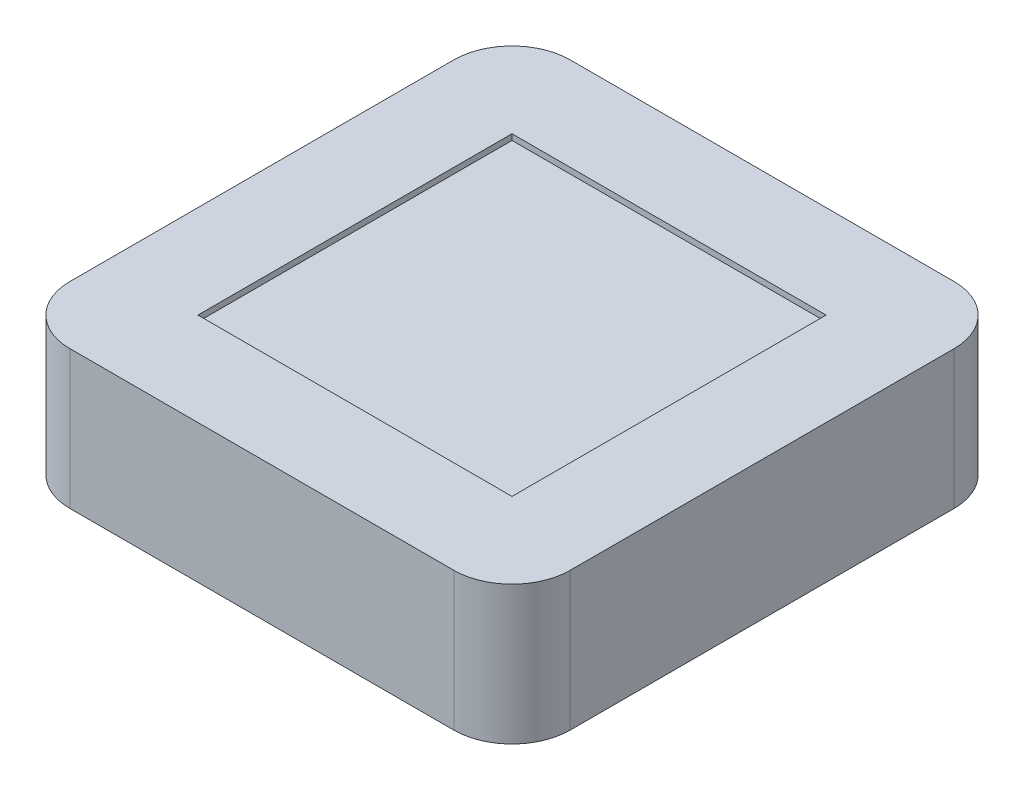
ISO-10303-21;
HEADER;
FILE_DESCRIPTION(('STEP AP214'),'2;1');
FILE_NAME('part.step','',(''),(''),'','','');
FILE_SCHEMA(('AUTOMOTIVE_DESIGN { 1 0 10303 214 1 1 1 1 }'));
ENDSEC;
DATA;
#1=APPLICATION_CONTEXT('core data for automotive mechanical design processes');
#2=APPLICATION_PROTOCOL_DEFINITION('international standard','automotive_design',2000,#1);
#3=PRODUCT_CONTEXT('',#1,'mechanical');
#4=PRODUCT('Part','Part','',(#3));
#5=PRODUCT_RELATED_PRODUCT_CATEGORY('part','',(#4));
#6=PRODUCT_DEFINITION_FORMATION('','',#4);
#7=PRODUCT_DEFINITION_CONTEXT('part definition',#1,'design');
#8=PRODUCT_DEFINITION('design','',#6,#7);
#9=PRODUCT_DEFINITION_SHAPE('','',#8);
#10=(LENGTH_UNIT() NAMED_UNIT(*) SI_UNIT(.MILLI.,.METRE.));
#11=(NAMED_UNIT(*) PLANE_ANGLE_UNIT() SI_UNIT($,.RADIAN.));
#12=(NAMED_UNIT(*) SI_UNIT($,.STERADIAN.) SOLID_ANGLE_UNIT());
#13=UNCERTAINTY_MEASURE_WITH_UNIT(LENGTH_MEASURE(1.E-05),#10,'distance_accuracy_value','');
#14=(GEOMETRIC_REPRESENTATION_CONTEXT(3) GLOBAL_UNCERTAINTY_ASSIGNED_CONTEXT((#13)) GLOBAL_UNIT_ASSIGNED_CONTEXT((#10,
#11,#12)) REPRESENTATION_CONTEXT('',''));
#15=CARTESIAN_POINT('',(0.,0.,0.));
#16=DIRECTION('',(0.,0.,1.));
#17=DIRECTION('',(1.,0.,0.));
#18=AXIS2_PLACEMENT_3D('',#15,#16,#17);
#19=CARTESIAN_POINT('',(0.,11.9,0.));
#20=DIRECTION('',(1.,0.,0.));
#21=DIRECTION('',(0.,0.,-1.));
#22=AXIS2_PLACEMENT_3D('',#19,#20,#21);
#23=PLANE('',#22);
#24=DIRECTION('',(0.,0.,1.));
#25=VECTOR('',#24,1.);
#26=CARTESIAN_POINT('',(0.,0.,0.));
#27=LINE('',#26,#25);
#28=CARTESIAN_POINT('',(0.,0.,-38.));
#29=VERTEX_POINT('',#28);
#30=CARTESIAN_POINT('',(0.,0.,-5.));
#31=VERTEX_POINT('',#30);
#32=EDGE_CURVE('E162',#29,#31,#27,.T.);
#33=ORIENTED_EDGE('',*,*,#32,.T.);
#34=DIRECTION('',(0.,-1.,0.));
#35=VECTOR('',#34,1.);
#36=CARTESIAN_POINT('',(0.,11.9,-5.));
#37=LINE('',#36,#35);
#38=CARTESIAN_POINT('',(0.,11.9,-5.));
#39=VERTEX_POINT('',#38);
#40=EDGE_CURVE('E11',#31,#39,#37,.F.);
#41=ORIENTED_EDGE('',*,*,#40,.T.);
#42=DIRECTION('',(0.,0.,1.));
#43=VECTOR('',#42,1.);
#44=CARTESIAN_POINT('',(0.,11.9,0.));
#45=LINE('',#44,#43);
#46=CARTESIAN_POINT('',(0.,11.9,-38.));
#47=VERTEX_POINT('',#46);
#48=EDGE_CURVE('E166',#47,#39,#45,.T.);
#49=ORIENTED_EDGE('',*,*,#48,.F.);
#50=DIRECTION('',(0.,-1.,0.));
#51=VECTOR('',#50,1.);
#52=CARTESIAN_POINT('',(0.,11.9,-38.));
#53=LINE('',#52,#51);
#54=EDGE_CURVE('E41',#47,#29,#53,.T.);
#55=ORIENTED_EDGE('',*,*,#54,.T.);
#56=EDGE_LOOP('',(#33,#41,#49,#55));
#57=FACE_BOUND('',#56,.T.);
#58=ADVANCED_FACE('F33',(#57),#23,.F.);
#59=CARTESIAN_POINT('',(0.,11.9,0.));
#60=DIRECTION('',(0.,0.,-1.));
#61=DIRECTION('',(-1.,0.,0.));
#62=AXIS2_PLACEMENT_3D('',#59,#60,#61);
#63=PLANE('',#62);
#64=DIRECTION('',(1.,0.,0.));
#65=VECTOR('',#64,1.);
#66=CARTESIAN_POINT('',(0.,0.,0.));
#67=LINE('',#66,#65);
#68=CARTESIAN_POINT('',(5.,0.,0.));
#69=VERTEX_POINT('',#68);
#70=CARTESIAN_POINT('',(38.,0.,0.));
#71=VERTEX_POINT('',#70);
#72=EDGE_CURVE('E180',#69,#71,#67,.T.);
#73=ORIENTED_EDGE('',*,*,#72,.T.);
#74=DIRECTION('',(0.,-1.,0.));
#75=VECTOR('',#74,1.);
#76=CARTESIAN_POINT('',(38.,11.9,0.));
#77=LINE('',#76,#75);
#78=CARTESIAN_POINT('',(38.,11.9,0.));
#79=VERTEX_POINT('',#78);
#80=EDGE_CURVE('E202',#71,#79,#77,.F.);
#81=ORIENTED_EDGE('',*,*,#80,.T.);
#82=DIRECTION('',(1.,0.,0.));
#83=VECTOR('',#82,1.);
#84=CARTESIAN_POINT('',(0.,11.9,0.));
#85=LINE('',#84,#83);
#86=CARTESIAN_POINT('',(5.,11.9,0.));
#87=VERTEX_POINT('',#86);
#88=EDGE_CURVE('E169',#87,#79,#85,.T.);
#89=ORIENTED_EDGE('',*,*,#88,.F.);
#90=DIRECTION('',(0.,-1.,0.));
#91=VECTOR('',#90,1.);
#92=CARTESIAN_POINT('',(5.,11.9,0.));
#93=LINE('',#92,#91);
#94=EDGE_CURVE('E199',#87,#69,#93,.T.);
#95=ORIENTED_EDGE('',*,*,#94,.T.);
#96=EDGE_LOOP('',(#73,#81,#89,#95));
#97=FACE_BOUND('',#96,.T.);
#98=ADVANCED_FACE('F233',(#97),#63,.F.);
#99=CARTESIAN_POINT('',(43.,11.9,0.));
#100=DIRECTION('',(-1.,0.,0.));
#101=DIRECTION('',(0.,0.,1.));
#102=AXIS2_PLACEMENT_3D('',#99,#100,#101);
#103=PLANE('',#102);
#104=DIRECTION('',(0.,0.,-1.));
#105=VECTOR('',#104,1.);
#106=CARTESIAN_POINT('',(43.,11.9,0.));
#107=LINE('',#106,#105);
#108=CARTESIAN_POINT('',(43.,11.9,-5.));
#109=VERTEX_POINT('',#108);
#110=CARTESIAN_POINT('',(43.,11.9,-38.));
#111=VERTEX_POINT('',#110);
#112=EDGE_CURVE('E173',#109,#111,#107,.T.);
#113=ORIENTED_EDGE('',*,*,#112,.F.);
#114=DIRECTION('',(0.,-1.,0.));
#115=VECTOR('',#114,1.);
#116=CARTESIAN_POINT('',(43.,11.9,-5.));
#117=LINE('',#116,#115);
#118=CARTESIAN_POINT('',(43.,0.,-5.));
#119=VERTEX_POINT('',#118);
#120=EDGE_CURVE('E188',#109,#119,#117,.T.);
#121=ORIENTED_EDGE('',*,*,#120,.T.);
#122=DIRECTION('',(0.,0.,-1.));
#123=VECTOR('',#122,1.);
#124=CARTESIAN_POINT('',(43.,0.,0.));
#125=LINE('',#124,#123);
#126=CARTESIAN_POINT('',(43.,0.,-38.));
#127=VERTEX_POINT('',#126);
#128=EDGE_CURVE('E183',#119,#127,#125,.T.);
#129=ORIENTED_EDGE('',*,*,#128,.T.);
#130=DIRECTION('',(0.,-1.,0.));
#131=VECTOR('',#130,1.);
#132=CARTESIAN_POINT('',(43.,11.9,-38.));
#133=LINE('',#132,#131);
#134=EDGE_CURVE('E177',#127,#111,#133,.F.);
#135=ORIENTED_EDGE('',*,*,#134,.T.);
#136=EDGE_LOOP('',(#113,#121,#129,#135));
#137=FACE_BOUND('',#136,.T.);
#138=ADVANCED_FACE('F242',(#137),#103,.F.);
#139=CARTESIAN_POINT('',(0.,11.9,-43.));
#140=DIRECTION('',(0.,0.,1.));
#141=DIRECTION('',(1.,0.,0.));
#142=AXIS2_PLACEMENT_3D('',#139,#140,#141);
#143=PLANE('',#142);
#144=DIRECTION('',(-1.,0.,0.));
#145=VECTOR('',#144,1.);
#146=CARTESIAN_POINT('',(0.,11.9,-43.));
#147=LINE('',#146,#145);
#148=CARTESIAN_POINT('',(38.,11.9,-43.));
#149=VERTEX_POINT('',#148);
#150=CARTESIAN_POINT('',(4.99999999999999,11.9,-43.));
#151=VERTEX_POINT('',#150);
#152=EDGE_CURVE('E175',#149,#151,#147,.T.);
#153=ORIENTED_EDGE('',*,*,#152,.F.);
#154=DIRECTION('',(0.,-1.,0.));
#155=VECTOR('',#154,1.);
#156=CARTESIAN_POINT('',(38.,11.9,-43.));
#157=LINE('',#156,#155);
#158=CARTESIAN_POINT('',(38.,0.,-43.));
#159=VERTEX_POINT('',#158);
#160=EDGE_CURVE('E212',#149,#159,#157,.T.);
#161=ORIENTED_EDGE('',*,*,#160,.T.);
#162=DIRECTION('',(-1.,0.,0.));
#163=VECTOR('',#162,1.);
#164=CARTESIAN_POINT('',(0.,0.,-43.));
#165=LINE('',#164,#163);
#166=CARTESIAN_POINT('',(4.99999999999999,0.,-43.));
#167=VERTEX_POINT('',#166);
#168=EDGE_CURVE('E170',#159,#167,#165,.T.);
#169=ORIENTED_EDGE('',*,*,#168,.T.);
#170=DIRECTION('',(0.,-1.,0.));
#171=VECTOR('',#170,1.);
#172=CARTESIAN_POINT('',(4.99999999999999,11.9,-43.));
#173=LINE('',#172,#171);
#174=EDGE_CURVE('E48',#167,#151,#173,.F.);
#175=ORIENTED_EDGE('',*,*,#174,.T.);
#176=EDGE_LOOP('',(#153,#161,#169,#175));
#177=FACE_BOUND('',#176,.T.);
#178=ADVANCED_FACE('F247',(#177),#143,.F.);
#179=CARTESIAN_POINT('',(0.,11.9,0.));
#180=DIRECTION('',(0.,-1.,0.));
#181=DIRECTION('',(0.,0.,-1.));
#182=AXIS2_PLACEMENT_3D('',#179,#180,#181);
#183=PLANE('',#182);
#184=DIRECTION('',(-1.,0.,0.));
#185=VECTOR('',#184,1.);
#186=CARTESIAN_POINT('',(7.99999999999999,11.9,-35.));
#187=LINE('',#186,#185);
#188=CARTESIAN_POINT('',(35.,11.9,-35.));
#189=VERTEX_POINT('',#188);
#190=CARTESIAN_POINT('',(7.99999999999999,11.9,-35.));
#191=VERTEX_POINT('',#190);
#192=EDGE_CURVE('E156',#189,#191,#187,.T.);
#193=ORIENTED_EDGE('',*,*,#192,.F.);
#194=DIRECTION('',(0.,0.,-1.));
#195=VECTOR('',#194,1.);
#196=CARTESIAN_POINT('',(35.,11.9,-7.99999999999998));
#197=LINE('',#196,#195);
#198=CARTESIAN_POINT('',(35.,11.9,-7.99999999999998));
#199=VERTEX_POINT('',#198);
#200=EDGE_CURVE('E130',#199,#189,#197,.T.);
#201=ORIENTED_EDGE('',*,*,#200,.F.);
#202=DIRECTION('',(1.,0.,0.));
#203=VECTOR('',#202,1.);
#204=CARTESIAN_POINT('',(7.99999999999999,11.9,-7.99999999999998));
#205=LINE('',#204,#203);
#206=CARTESIAN_POINT('',(7.99999999999999,11.9,-7.99999999999998));
#207=VERTEX_POINT('',#206);
#208=EDGE_CURVE('E147',#207,#199,#205,.T.);
#209=ORIENTED_EDGE('',*,*,#208,.F.);
#210=DIRECTION('',(0.,0.,1.));
#211=VECTOR('',#210,1.);
#212=CARTESIAN_POINT('',(7.99999999999999,11.9,-7.99999999999998));
#213=LINE('',#212,#211);
#214=EDGE_CURVE('E150',#191,#207,#213,.T.);
#215=ORIENTED_EDGE('',*,*,#214,.F.);
#216=EDGE_LOOP('',(#193,#201,#209,#215));
#217=FACE_BOUND('',#216,.T.);
#218=ORIENTED_EDGE('',*,*,#88,.T.);
#219=CARTESIAN_POINT('',(38.,11.9,-5.));
#220=DIRECTION('',(0.,-1.,0.));
#221=DIRECTION('',(0.,0.,-1.));
#222=AXIS2_PLACEMENT_3D('',#219,#220,#221);
#223=CIRCLE('',#222,5.);
#224=EDGE_CURVE('E209',#79,#109,#223,.F.);
#225=ORIENTED_EDGE('',*,*,#224,.T.);
#226=ORIENTED_EDGE('',*,*,#112,.T.);
#227=CARTESIAN_POINT('',(38.,11.9,-38.));
#228=DIRECTION('',(0.,-1.,0.));
#229=DIRECTION('',(0.,0.,-1.));
#230=AXIS2_PLACEMENT_3D('',#227,#228,#229);
#231=CIRCLE('',#230,5.);
#232=EDGE_CURVE('E55',#111,#149,#231,.F.);
#233=ORIENTED_EDGE('',*,*,#232,.T.);
#234=ORIENTED_EDGE('',*,*,#152,.T.);
#235=CARTESIAN_POINT('',(4.99999999999999,11.9,-38.));
#236=DIRECTION('',(0.,-1.,0.));
#237=DIRECTION('',(0.,0.,-1.));
#238=AXIS2_PLACEMENT_3D('',#235,#236,#237);
#239=CIRCLE('',#238,5.);
#240=EDGE_CURVE('E204',#151,#47,#239,.F.);
#241=ORIENTED_EDGE('',*,*,#240,.T.);
#242=ORIENTED_EDGE('',*,*,#48,.T.);
#243=CARTESIAN_POINT('',(5.,11.9,-5.));
#244=DIRECTION('',(0.,-1.,0.));
#245=DIRECTION('',(0.,0.,-1.));
#246=AXIS2_PLACEMENT_3D('',#243,#244,#245);
#247=CIRCLE('',#246,5.);
#248=EDGE_CURVE('E206',#39,#87,#247,.F.);
#249=ORIENTED_EDGE('',*,*,#248,.T.);
#250=EDGE_LOOP('',(#218,#225,#226,#233,#234,#241,#242,#249));
#251=FACE_BOUND('',#250,.T.);
#252=ADVANCED_FACE('F236',(#217,#251),#183,.F.);
#253=CARTESIAN_POINT('',(0.,0.,0.));
#254=DIRECTION('',(0.,-1.,0.));
#255=DIRECTION('',(0.,0.,-1.));
#256=AXIS2_PLACEMENT_3D('',#253,#254,#255);
#257=PLANE('',#256);
#258=ORIENTED_EDGE('',*,*,#128,.F.);
#259=CARTESIAN_POINT('',(38.,0.,-5.));
#260=DIRECTION('',(0.,-1.,0.));
#261=DIRECTION('',(0.,0.,-1.));
#262=AXIS2_PLACEMENT_3D('',#259,#260,#261);
#263=CIRCLE('',#262,5.);
#264=EDGE_CURVE('E197',#119,#71,#263,.T.);
#265=ORIENTED_EDGE('',*,*,#264,.T.);
#266=ORIENTED_EDGE('',*,*,#72,.F.);
#267=CARTESIAN_POINT('',(5.,0.,-5.));
#268=DIRECTION('',(0.,-1.,0.));
#269=DIRECTION('',(0.,0.,-1.));
#270=AXIS2_PLACEMENT_3D('',#267,#268,#269);
#271=CIRCLE('',#270,5.);
#272=EDGE_CURVE('E193',#69,#31,#271,.T.);
#273=ORIENTED_EDGE('',*,*,#272,.T.);
#274=ORIENTED_EDGE('',*,*,#32,.F.);
#275=CARTESIAN_POINT('',(4.99999999999999,0.,-38.));
#276=DIRECTION('',(0.,-1.,0.));
#277=DIRECTION('',(0.,0.,-1.));
#278=AXIS2_PLACEMENT_3D('',#275,#276,#277);
#279=CIRCLE('',#278,5.);
#280=EDGE_CURVE('E191',#29,#167,#279,.T.);
#281=ORIENTED_EDGE('',*,*,#280,.T.);
#282=ORIENTED_EDGE('',*,*,#168,.F.);
#283=CARTESIAN_POINT('',(38.,0.,-38.));
#284=DIRECTION('',(0.,-1.,0.));
#285=DIRECTION('',(0.,0.,-1.));
#286=AXIS2_PLACEMENT_3D('',#283,#284,#285);
#287=CIRCLE('',#286,5.);
#288=EDGE_CURVE('E195',#159,#127,#287,.T.);
#289=ORIENTED_EDGE('',*,*,#288,.T.);
#290=EDGE_LOOP('',(#258,#265,#266,#273,#274,#281,#282,#289));
#291=FACE_BOUND('',#290,.T.);
#292=ADVANCED_FACE('F224',(#291),#257,.T.);
#293=CARTESIAN_POINT('',(35.,11.4,-7.99999999999998));
#294=DIRECTION('',(1.,0.,0.));
#295=DIRECTION('',(0.,0.,-1.));
#296=AXIS2_PLACEMENT_3D('',#293,#294,#295);
#297=PLANE('',#296);
#298=ORIENTED_EDGE('',*,*,#200,.T.);
#299=DIRECTION('',(0.,1.,0.));
#300=VECTOR('',#299,1.);
#301=CARTESIAN_POINT('',(35.,11.4,-35.));
#302=LINE('',#301,#300);
#303=CARTESIAN_POINT('',(35.,11.4,-35.));
#304=VERTEX_POINT('',#303);
#305=EDGE_CURVE('E123',#304,#189,#302,.T.);
#306=ORIENTED_EDGE('',*,*,#305,.F.);
#307=DIRECTION('',(0.,0.,-1.));
#308=VECTOR('',#307,1.);
#309=CARTESIAN_POINT('',(35.,11.4,-7.99999999999998));
#310=LINE('',#309,#308);
#311=CARTESIAN_POINT('',(35.,11.4,-7.99999999999998));
#312=VERTEX_POINT('',#311);
#313=EDGE_CURVE('E127',#312,#304,#310,.T.);
#314=ORIENTED_EDGE('',*,*,#313,.F.);
#315=DIRECTION('',(0.,1.,0.));
#316=VECTOR('',#315,1.);
#317=CARTESIAN_POINT('',(35.,11.4,-7.99999999999998));
#318=LINE('',#317,#316);
#319=EDGE_CURVE('E160',#312,#199,#318,.T.);
#320=ORIENTED_EDGE('',*,*,#319,.T.);
#321=EDGE_LOOP('',(#298,#306,#314,#320));
#322=FACE_BOUND('',#321,.T.);
#323=ADVANCED_FACE('F125',(#322),#297,.F.);
#324=CARTESIAN_POINT('',(7.99999999999999,11.4,-7.99999999999998));
#325=DIRECTION('',(0.,0.,1.));
#326=DIRECTION('',(1.,0.,0.));
#327=AXIS2_PLACEMENT_3D('',#324,#325,#326);
#328=PLANE('',#327);
#329=ORIENTED_EDGE('',*,*,#208,.T.);
#330=ORIENTED_EDGE('',*,*,#319,.F.);
#331=DIRECTION('',(1.,0.,0.));
#332=VECTOR('',#331,1.);
#333=CARTESIAN_POINT('',(7.99999999999999,11.4,-7.99999999999998));
#334=LINE('',#333,#332);
#335=CARTESIAN_POINT('',(7.99999999999999,11.4,-7.99999999999998));
#336=VERTEX_POINT('',#335);
#337=EDGE_CURVE('E135',#336,#312,#334,.T.);
#338=ORIENTED_EDGE('',*,*,#337,.F.);
#339=DIRECTION('',(0.,1.,0.));
#340=VECTOR('',#339,1.);
#341=CARTESIAN_POINT('',(7.99999999999999,11.4,-7.99999999999998));
#342=LINE('',#341,#340);
#343=EDGE_CURVE('E163',#336,#207,#342,.T.);
#344=ORIENTED_EDGE('',*,*,#343,.T.);
#345=EDGE_LOOP('',(#329,#330,#338,#344));
#346=FACE_BOUND('',#345,.T.);
#347=ADVANCED_FACE('F307',(#346),#328,.F.);
#348=CARTESIAN_POINT('',(7.99999999999999,11.4,-7.99999999999998));
#349=DIRECTION('',(-1.,0.,0.));
#350=DIRECTION('',(0.,0.,1.));
#351=AXIS2_PLACEMENT_3D('',#348,#349,#350);
#352=PLANE('',#351);
#353=ORIENTED_EDGE('',*,*,#214,.T.);
#354=ORIENTED_EDGE('',*,*,#343,.F.);
#355=DIRECTION('',(0.,0.,1.));
#356=VECTOR('',#355,1.);
#357=CARTESIAN_POINT('',(7.99999999999999,11.4,-7.99999999999998));
#358=LINE('',#357,#356);
#359=CARTESIAN_POINT('',(7.99999999999999,11.4,-35.));
#360=VERTEX_POINT('',#359);
#361=EDGE_CURVE('E143',#360,#336,#358,.T.);
#362=ORIENTED_EDGE('',*,*,#361,.F.);
#363=DIRECTION('',(0.,1.,0.));
#364=VECTOR('',#363,1.);
#365=CARTESIAN_POINT('',(7.99999999999999,11.4,-35.));
#366=LINE('',#365,#364);
#367=EDGE_CURVE('E134',#360,#191,#366,.T.);
#368=ORIENTED_EDGE('',*,*,#367,.T.);
#369=EDGE_LOOP('',(#353,#354,#362,#368));
#370=FACE_BOUND('',#369,.T.);
#371=ADVANCED_FACE('F299',(#370),#352,.F.);
#372=CARTESIAN_POINT('',(7.99999999999999,11.4,-35.));
#373=DIRECTION('',(0.,0.,-1.));
#374=DIRECTION('',(-1.,0.,0.));
#375=AXIS2_PLACEMENT_3D('',#372,#373,#374);
#376=PLANE('',#375);
#377=ORIENTED_EDGE('',*,*,#192,.T.);
#378=ORIENTED_EDGE('',*,*,#367,.F.);
#379=DIRECTION('',(-1.,0.,0.));
#380=VECTOR('',#379,1.);
#381=CARTESIAN_POINT('',(7.99999999999999,11.4,-35.));
#382=LINE('',#381,#380);
#383=EDGE_CURVE('E138',#304,#360,#382,.T.);
#384=ORIENTED_EDGE('',*,*,#383,.F.);
#385=ORIENTED_EDGE('',*,*,#305,.T.);
#386=EDGE_LOOP('',(#377,#378,#384,#385));
#387=FACE_BOUND('',#386,.T.);
#388=ADVANCED_FACE('F139',(#387),#376,.F.);
#389=CARTESIAN_POINT('',(0.,11.4,0.));
#390=DIRECTION('',(0.,-1.,0.));
#391=DIRECTION('',(0.,0.,-1.));
#392=AXIS2_PLACEMENT_3D('',#389,#390,#391);
#393=PLANE('',#392);
#394=ORIENTED_EDGE('',*,*,#313,.T.);
#395=ORIENTED_EDGE('',*,*,#383,.T.);
#396=ORIENTED_EDGE('',*,*,#361,.T.);
#397=ORIENTED_EDGE('',*,*,#337,.T.);
#398=EDGE_LOOP('',(#394,#395,#396,#397));
#399=FACE_BOUND('',#398,.T.);
#400=ADVANCED_FACE('F145',(#399),#393,.F.);
#401=CARTESIAN_POINT('',(38.,11.9,-5.));
#402=DIRECTION('',(0.,-1.,0.));
#403=DIRECTION('',(0.,0.,-1.));
#404=AXIS2_PLACEMENT_3D('',#401,#402,#403);
#405=CYLINDRICAL_SURFACE('',#404,5.);
#406=ORIENTED_EDGE('',*,*,#224,.F.);
#407=ORIENTED_EDGE('',*,*,#80,.F.);
#408=ORIENTED_EDGE('',*,*,#264,.F.);
#409=ORIENTED_EDGE('',*,*,#120,.F.);
#410=EDGE_LOOP('',(#406,#407,#408,#409));
#411=FACE_BOUND('',#410,.T.);
#412=ADVANCED_FACE('F240',(#411),#405,.T.);
#413=CARTESIAN_POINT('',(38.,11.9,-38.));
#414=DIRECTION('',(0.,-1.,0.));
#415=DIRECTION('',(0.,0.,-1.));
#416=AXIS2_PLACEMENT_3D('',#413,#414,#415);
#417=CYLINDRICAL_SURFACE('',#416,5.);
#418=ORIENTED_EDGE('',*,*,#232,.F.);
#419=ORIENTED_EDGE('',*,*,#134,.F.);
#420=ORIENTED_EDGE('',*,*,#288,.F.);
#421=ORIENTED_EDGE('',*,*,#160,.F.);
#422=EDGE_LOOP('',(#418,#419,#420,#421));
#423=FACE_BOUND('',#422,.T.);
#424=ADVANCED_FACE('F246',(#423),#417,.T.);
#425=CARTESIAN_POINT('',(5.,11.9,-5.));
#426=DIRECTION('',(0.,-1.,0.));
#427=DIRECTION('',(0.,0.,-1.));
#428=AXIS2_PLACEMENT_3D('',#425,#426,#427);
#429=CYLINDRICAL_SURFACE('',#428,5.);
#430=ORIENTED_EDGE('',*,*,#248,.F.);
#431=ORIENTED_EDGE('',*,*,#40,.F.);
#432=ORIENTED_EDGE('',*,*,#272,.F.);
#433=ORIENTED_EDGE('',*,*,#94,.F.);
#434=EDGE_LOOP('',(#430,#431,#432,#433));
#435=FACE_BOUND('',#434,.T.);
#436=ADVANCED_FACE('F230',(#435),#429,.T.);
#437=CARTESIAN_POINT('',(4.99999999999999,11.9,-38.));
#438=DIRECTION('',(0.,-1.,0.));
#439=DIRECTION('',(0.,0.,-1.));
#440=AXIS2_PLACEMENT_3D('',#437,#438,#439);
#441=CYLINDRICAL_SURFACE('',#440,5.);
#442=ORIENTED_EDGE('',*,*,#240,.F.);
#443=ORIENTED_EDGE('',*,*,#174,.F.);
#444=ORIENTED_EDGE('',*,*,#280,.F.);
#445=ORIENTED_EDGE('',*,*,#54,.F.);
#446=EDGE_LOOP('',(#442,#443,#444,#445));
#447=FACE_BOUND('',#446,.T.);
#448=ADVANCED_FACE('F35',(#447),#441,.T.);
#449=CLOSED_SHELL('',(#58,#98,#138,#178,#252,#292,#323,#347,#371,#388,#400,#412,#424,#436,#448));
#450=MANIFOLD_SOLID_BREP('B2',#449);
#451=ADVANCED_BREP_SHAPE_REPRESENTATION('',(#18,#450),#14);
#452=SHAPE_DEFINITION_REPRESENTATION(#9,#451);
ENDSEC;
END-ISO-10303-21;
